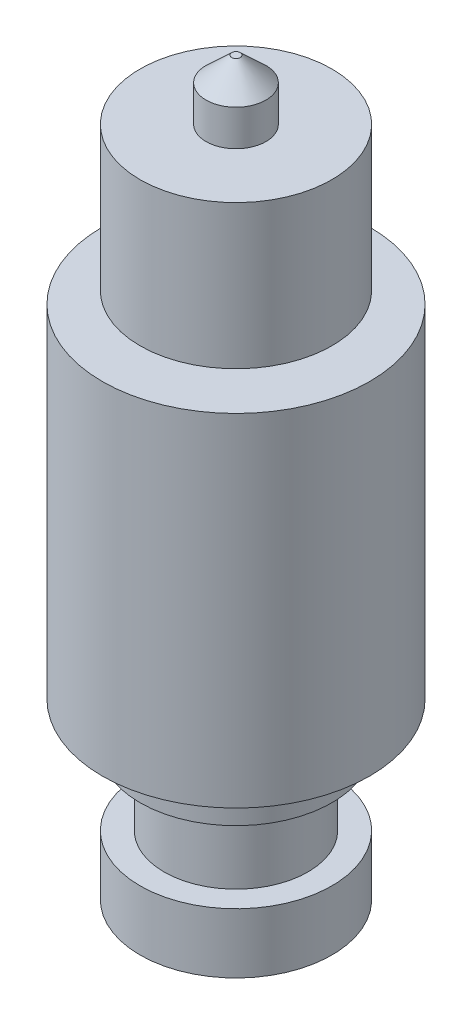
ISO-10303-21;
HEADER;
FILE_DESCRIPTION(('STEP AP214'),'2;1');
FILE_NAME('part.step','',(''),(''),'','','');
FILE_SCHEMA(('AUTOMOTIVE_DESIGN { 1 0 10303 214 1 1 1 1 }'));
ENDSEC;
DATA;
#1=APPLICATION_CONTEXT('core data for automotive mechanical design processes');
#2=APPLICATION_PROTOCOL_DEFINITION('international standard','automotive_design',2000,#1);
#3=PRODUCT_CONTEXT('',#1,'mechanical');
#4=PRODUCT('Part','Part','',(#3));
#5=PRODUCT_RELATED_PRODUCT_CATEGORY('part','',(#4));
#6=PRODUCT_DEFINITION_FORMATION('','',#4);
#7=PRODUCT_DEFINITION_CONTEXT('part definition',#1,'design');
#8=PRODUCT_DEFINITION('design','',#6,#7);
#9=PRODUCT_DEFINITION_SHAPE('','',#8);
#10=(LENGTH_UNIT() NAMED_UNIT(*) SI_UNIT(.MILLI.,.METRE.));
#11=(NAMED_UNIT(*) PLANE_ANGLE_UNIT() SI_UNIT($,.RADIAN.));
#12=(NAMED_UNIT(*) SI_UNIT($,.STERADIAN.) SOLID_ANGLE_UNIT());
#13=UNCERTAINTY_MEASURE_WITH_UNIT(LENGTH_MEASURE(1.E-05),#10,'distance_accuracy_value','');
#14=(GEOMETRIC_REPRESENTATION_CONTEXT(3) GLOBAL_UNCERTAINTY_ASSIGNED_CONTEXT((#13)) GLOBAL_UNIT_ASSIGNED_CONTEXT((#10,
#11,#12)) REPRESENTATION_CONTEXT('',''));
#15=CARTESIAN_POINT('',(0.,0.,0.));
#16=DIRECTION('',(0.,0.,1.));
#17=DIRECTION('',(1.,0.,0.));
#18=AXIS2_PLACEMENT_3D('',#15,#16,#17);
#19=CARTESIAN_POINT('',(0.,5.,0.));
#20=DIRECTION('',(0.,-1.,0.));
#21=DIRECTION('',(0.,0.,-1.));
#22=AXIS2_PLACEMENT_3D('',#19,#20,#21);
#23=CYLINDRICAL_SURFACE('',#22,8.);
#24=CARTESIAN_POINT('',(0.,5.,0.));
#25=DIRECTION('',(0.,1.,0.));
#26=DIRECTION('',(0.,0.,1.));
#27=AXIS2_PLACEMENT_3D('',#24,#25,#26);
#28=CIRCLE('',#27,8.);
#29=CARTESIAN_POINT('',(0.,5.,8.));
#30=VERTEX_POINT('',#29);
#31=EDGE_CURVE('E10',#30,#30,#28,.T.);
#32=ORIENTED_EDGE('',*,*,#31,.F.);
#33=EDGE_LOOP('',(#32));
#34=FACE_BOUND('',#33,.T.);
#35=CARTESIAN_POINT('',(0.,0.,0.));
#36=DIRECTION('',(0.,1.,0.));
#37=DIRECTION('',(0.,0.,1.));
#38=AXIS2_PLACEMENT_3D('',#35,#36,#37);
#39=CIRCLE('',#38,8.);
#40=CARTESIAN_POINT('',(0.,0.,8.));
#41=VERTEX_POINT('',#40);
#42=EDGE_CURVE('E37',#41,#41,#39,.T.);
#43=ORIENTED_EDGE('',*,*,#42,.T.);
#44=EDGE_LOOP('',(#43));
#45=FACE_BOUND('',#44,.T.);
#46=ADVANCED_FACE('F34',(#34,#45),#23,.T.);
#47=CARTESIAN_POINT('',(0.,5.,0.));
#48=DIRECTION('',(0.,1.,0.));
#49=DIRECTION('',(0.,0.,1.));
#50=AXIS2_PLACEMENT_3D('',#47,#48,#49);
#51=PLANE('',#50);
#52=CARTESIAN_POINT('',(0.,5.,0.));
#53=DIRECTION('',(0.,1.,0.));
#54=DIRECTION('',(0.,0.,1.));
#55=AXIS2_PLACEMENT_3D('',#52,#53,#54);
#56=CIRCLE('',#55,6.);
#57=CARTESIAN_POINT('',(0.,5.,6.));
#58=VERTEX_POINT('',#57);
#59=EDGE_CURVE('E46',#58,#58,#56,.T.);
#60=ORIENTED_EDGE('',*,*,#59,.F.);
#61=EDGE_LOOP('',(#60));
#62=FACE_BOUND('',#61,.T.);
#63=ORIENTED_EDGE('',*,*,#31,.T.);
#64=EDGE_LOOP('',(#63));
#65=FACE_BOUND('',#64,.T.);
#66=ADVANCED_FACE('F125',(#62,#65),#51,.T.);
#67=CARTESIAN_POINT('',(0.,0.,0.));
#68=DIRECTION('',(0.,1.,0.));
#69=DIRECTION('',(0.,0.,1.));
#70=AXIS2_PLACEMENT_3D('',#67,#68,#69);
#71=PLANE('',#70);
#72=ORIENTED_EDGE('',*,*,#42,.F.);
#73=EDGE_LOOP('',(#72));
#74=FACE_BOUND('',#73,.T.);
#75=ADVANCED_FACE('F130',(#74),#71,.F.);
#76=CARTESIAN_POINT('',(0.,11.,0.));
#77=DIRECTION('',(0.,-1.,0.));
#78=DIRECTION('',(0.,0.,-1.));
#79=AXIS2_PLACEMENT_3D('',#76,#77,#78);
#80=CYLINDRICAL_SURFACE('',#79,6.);
#81=CARTESIAN_POINT('',(0.,11.,0.));
#82=DIRECTION('',(0.,1.,0.));
#83=DIRECTION('',(0.,0.,1.));
#84=AXIS2_PLACEMENT_3D('',#81,#82,#83);
#85=CIRCLE('',#84,6.);
#86=CARTESIAN_POINT('',(0.,11.,6.));
#87=VERTEX_POINT('',#86);
#88=EDGE_CURVE('E44',#87,#87,#85,.T.);
#89=ORIENTED_EDGE('',*,*,#88,.F.);
#90=EDGE_LOOP('',(#89));
#91=FACE_BOUND('',#90,.T.);
#92=ORIENTED_EDGE('',*,*,#59,.T.);
#93=EDGE_LOOP('',(#92));
#94=FACE_BOUND('',#93,.T.);
#95=ADVANCED_FACE('F137',(#91,#94),#80,.T.);
#96=CARTESIAN_POINT('',(0.,12.5,0.));
#97=DIRECTION('',(0.,-1.,0.));
#98=DIRECTION('',(0.,0.,-1.));
#99=AXIS2_PLACEMENT_3D('',#96,#97,#98);
#100=CYLINDRICAL_SURFACE('',#99,8.);
#101=CARTESIAN_POINT('',(0.,12.5,0.));
#102=DIRECTION('',(0.,1.,0.));
#103=DIRECTION('',(0.,0.,1.));
#104=AXIS2_PLACEMENT_3D('',#101,#102,#103);
#105=CIRCLE('',#104,8.);
#106=CARTESIAN_POINT('',(0.,12.5,8.));
#107=VERTEX_POINT('',#106);
#108=EDGE_CURVE('E49',#107,#107,#105,.T.);
#109=ORIENTED_EDGE('',*,*,#108,.F.);
#110=EDGE_LOOP('',(#109));
#111=FACE_BOUND('',#110,.T.);
#112=CARTESIAN_POINT('',(0.,11.,0.));
#113=DIRECTION('',(0.,1.,0.));
#114=DIRECTION('',(0.,0.,1.));
#115=AXIS2_PLACEMENT_3D('',#112,#113,#114);
#116=CIRCLE('',#115,8.);
#117=CARTESIAN_POINT('',(0.,11.,8.));
#118=VERTEX_POINT('',#117);
#119=EDGE_CURVE('E52',#118,#118,#116,.T.);
#120=ORIENTED_EDGE('',*,*,#119,.T.);
#121=EDGE_LOOP('',(#120));
#122=FACE_BOUND('',#121,.T.);
#123=ADVANCED_FACE('F141',(#111,#122),#100,.T.);
#124=CARTESIAN_POINT('',(0.,12.5,0.));
#125=DIRECTION('',(0.,1.,0.));
#126=DIRECTION('',(0.,0.,1.));
#127=AXIS2_PLACEMENT_3D('',#124,#125,#126);
#128=PLANE('',#127);
#129=CARTESIAN_POINT('',(0.,12.5,0.));
#130=DIRECTION('',(0.,1.,0.));
#131=DIRECTION('',(0.,0.,1.));
#132=AXIS2_PLACEMENT_3D('',#129,#130,#131);
#133=CIRCLE('',#132,5.);
#134=CARTESIAN_POINT('',(0.,12.5,5.));
#135=VERTEX_POINT('',#134);
#136=EDGE_CURVE('E58',#135,#135,#133,.T.);
#137=ORIENTED_EDGE('',*,*,#136,.F.);
#138=EDGE_LOOP('',(#137));
#139=FACE_BOUND('',#138,.T.);
#140=ORIENTED_EDGE('',*,*,#108,.T.);
#141=EDGE_LOOP('',(#140));
#142=FACE_BOUND('',#141,.T.);
#143=ADVANCED_FACE('F147',(#139,#142),#128,.T.);
#144=CARTESIAN_POINT('',(0.,11.,0.));
#145=DIRECTION('',(0.,1.,0.));
#146=DIRECTION('',(0.,0.,1.));
#147=AXIS2_PLACEMENT_3D('',#144,#145,#146);
#148=PLANE('',#147);
#149=ORIENTED_EDGE('',*,*,#88,.T.);
#150=EDGE_LOOP('',(#149));
#151=FACE_BOUND('',#150,.T.);
#152=ORIENTED_EDGE('',*,*,#119,.F.);
#153=EDGE_LOOP('',(#152));
#154=FACE_BOUND('',#153,.T.);
#155=ADVANCED_FACE('F149',(#151,#154),#148,.F.);
#156=CARTESIAN_POINT('',(0.,14.5,0.));
#157=DIRECTION('',(0.,-1.,0.));
#158=DIRECTION('',(0.,0.,-1.));
#159=AXIS2_PLACEMENT_3D('',#156,#157,#158);
#160=CYLINDRICAL_SURFACE('',#159,5.);
#161=CARTESIAN_POINT('',(0.,14.5,0.));
#162=DIRECTION('',(0.,1.,0.));
#163=DIRECTION('',(0.,0.,1.));
#164=AXIS2_PLACEMENT_3D('',#161,#162,#163);
#165=CIRCLE('',#164,5.);
#166=CARTESIAN_POINT('',(0.,14.5,5.));
#167=VERTEX_POINT('',#166);
#168=EDGE_CURVE('E55',#167,#167,#165,.T.);
#169=ORIENTED_EDGE('',*,*,#168,.F.);
#170=EDGE_LOOP('',(#169));
#171=FACE_BOUND('',#170,.T.);
#172=ORIENTED_EDGE('',*,*,#136,.T.);
#173=EDGE_LOOP('',(#172));
#174=FACE_BOUND('',#173,.T.);
#175=ADVANCED_FACE('F152',(#171,#174),#160,.T.);
#176=CARTESIAN_POINT('',(0.,43.,0.));
#177=DIRECTION('',(0.,-1.,0.));
#178=DIRECTION('',(0.,0.,-1.));
#179=AXIS2_PLACEMENT_3D('',#176,#177,#178);
#180=CYLINDRICAL_SURFACE('',#179,11.15);
#181=CARTESIAN_POINT('',(0.,43.,0.));
#182=DIRECTION('',(0.,1.,0.));
#183=DIRECTION('',(0.,0.,1.));
#184=AXIS2_PLACEMENT_3D('',#181,#182,#183);
#185=CIRCLE('',#184,11.15);
#186=CARTESIAN_POINT('',(0.,43.,-11.15));
#187=VERTEX_POINT('',#186);
#188=EDGE_CURVE('E61',#187,#187,#185,.T.);
#189=CARTESIAN_POINT('',(0.,14.5,0.));
#190=DIRECTION('',(0.,1.,0.));
#191=DIRECTION('',(0.,0.,1.));
#192=AXIS2_PLACEMENT_3D('',#189,#190,#191);
#193=CIRCLE('',#192,11.15);
#194=CARTESIAN_POINT('',(0.,14.5,-11.15));
#195=VERTEX_POINT('',#194);
#196=EDGE_CURVE('E64',#195,#195,#193,.T.);
#197=CARTESIAN_POINT('',(0.,43.,-11.15));
#198=CARTESIAN_POINT('',(0.,42.703125,-11.15));
#199=CARTESIAN_POINT('',(0.,42.40625,-11.15));
#200=CARTESIAN_POINT('',(0.,41.8125,-11.15));
#201=CARTESIAN_POINT('',(0.,41.515625,-11.15));
#202=CARTESIAN_POINT('',(0.,40.921875,-11.15));
#203=CARTESIAN_POINT('',(0.,40.625,-11.15));
#204=CARTESIAN_POINT('',(0.,40.03125,-11.15));
#205=CARTESIAN_POINT('',(0.,39.734375,-11.15));
#206=CARTESIAN_POINT('',(0.,39.140625,-11.15));
#207=CARTESIAN_POINT('',(0.,38.84375,-11.15));
#208=CARTESIAN_POINT('',(0.,38.25,-11.15));
#209=CARTESIAN_POINT('',(0.,37.953125,-11.15));
#210=CARTESIAN_POINT('',(0.,37.359375,-11.15));
#211=CARTESIAN_POINT('',(0.,37.0625,-11.15));
#212=CARTESIAN_POINT('',(0.,36.46875,-11.15));
#213=CARTESIAN_POINT('',(0.,36.171875,-11.15));
#214=CARTESIAN_POINT('',(0.,35.578125,-11.15));
#215=CARTESIAN_POINT('',(0.,35.28125,-11.15));
#216=CARTESIAN_POINT('',(0.,34.6875,-11.15));
#217=CARTESIAN_POINT('',(0.,34.390625,-11.15));
#218=CARTESIAN_POINT('',(0.,33.796875,-11.15));
#219=CARTESIAN_POINT('',(0.,33.5,-11.15));
#220=CARTESIAN_POINT('',(0.,32.90625,-11.15));
#221=CARTESIAN_POINT('',(0.,32.609375,-11.15));
#222=CARTESIAN_POINT('',(0.,32.015625,-11.15));
#223=CARTESIAN_POINT('',(0.,31.71875,-11.15));
#224=CARTESIAN_POINT('',(0.,31.125,-11.15));
#225=CARTESIAN_POINT('',(0.,30.828125,-11.15));
#226=CARTESIAN_POINT('',(0.,30.234375,-11.15));
#227=CARTESIAN_POINT('',(0.,29.9375,-11.15));
#228=CARTESIAN_POINT('',(0.,29.34375,-11.15));
#229=CARTESIAN_POINT('',(0.,29.046875,-11.15));
#230=CARTESIAN_POINT('',(0.,28.453125,-11.15));
#231=CARTESIAN_POINT('',(0.,28.15625,-11.15));
#232=CARTESIAN_POINT('',(0.,27.5625,-11.15));
#233=CARTESIAN_POINT('',(0.,27.265625,-11.15));
#234=CARTESIAN_POINT('',(0.,26.671875,-11.15));
#235=CARTESIAN_POINT('',(0.,26.375,-11.15));
#236=CARTESIAN_POINT('',(0.,25.78125,-11.15));
#237=CARTESIAN_POINT('',(0.,25.484375,-11.15));
#238=CARTESIAN_POINT('',(0.,24.890625,-11.15));
#239=CARTESIAN_POINT('',(0.,24.59375,-11.15));
#240=CARTESIAN_POINT('',(0.,24.,-11.15));
#241=CARTESIAN_POINT('',(0.,23.703125,-11.15));
#242=CARTESIAN_POINT('',(0.,23.109375,-11.15));
#243=CARTESIAN_POINT('',(0.,22.8125,-11.15));
#244=CARTESIAN_POINT('',(0.,22.21875,-11.15));
#245=CARTESIAN_POINT('',(0.,21.921875,-11.15));
#246=CARTESIAN_POINT('',(0.,21.328125,-11.15));
#247=CARTESIAN_POINT('',(0.,21.03125,-11.15));
#248=CARTESIAN_POINT('',(0.,20.4375,-11.15));
#249=CARTESIAN_POINT('',(0.,20.140625,-11.15));
#250=CARTESIAN_POINT('',(0.,19.546875,-11.15));
#251=CARTESIAN_POINT('',(0.,19.25,-11.15));
#252=CARTESIAN_POINT('',(0.,18.65625,-11.15));
#253=CARTESIAN_POINT('',(0.,18.359375,-11.15));
#254=CARTESIAN_POINT('',(0.,17.765625,-11.15));
#255=CARTESIAN_POINT('',(0.,17.46875,-11.15));
#256=CARTESIAN_POINT('',(0.,16.875,-11.15));
#257=CARTESIAN_POINT('',(0.,16.578125,-11.15));
#258=CARTESIAN_POINT('',(0.,15.984375,-11.15));
#259=CARTESIAN_POINT('',(0.,15.6875,-11.15));
#260=CARTESIAN_POINT('',(0.,15.09375,-11.15));
#261=CARTESIAN_POINT('',(0.,14.796875,-11.15));
#262=CARTESIAN_POINT('',(0.,14.5,-11.15));
#263=B_SPLINE_CURVE_WITH_KNOTS('',3,(#197,#198,#199,#200,#201,#202,#203,#204,#205,#206,#207,
#208,#209,#210,#211,#212,#213,#214,#215,#216,#217,#218,#219,#220,#221,#222,#223,#224,#225,#226,
#227,#228,#229,#230,#231,#232,#233,#234,#235,#236,#237,#238,#239,#240,#241,#242,#243,#244,#245,
#246,#247,#248,#249,#250,#251,#252,#253,#254,#255,#256,#257,#258,#259,#260,#261,#262),
.UNSPECIFIED.,.F.,.F.,(4,2,2,2,2,2,2,2,2,2,2,2,2,2,2,2,2,2,2,2,2,2,2,2,2,2,2,2,2,2,2,2,4),(0.,
0.890625000000006,1.78125000000001,2.671875,3.5625,4.453125,5.34375,6.234375,7.12500000000001,
8.015625,8.90625,9.796875,10.6875,11.578125,12.46875,13.359375,14.25,15.140625,16.03125,
16.921875,17.8125,18.703125,19.59375,20.484375,21.375,22.265625,23.15625,24.046875,24.9375,
25.828125,26.71875,27.609375,28.5),.UNSPECIFIED.);
#264=EDGE_CURVE('BSEAM159',#187,#195,#263,.T.);
#265=ORIENTED_EDGE('',*,*,#188,.F.);
#266=ORIENTED_EDGE('',*,*,#196,.T.);
#267=ORIENTED_EDGE('',*,*,#264,.T.);
#268=ORIENTED_EDGE('',*,*,#264,.F.);
#269=EDGE_LOOP('',(#265,#267,#266,#268));
#270=FACE_BOUND('',#269,.T.);
#271=ADVANCED_FACE('F159',(#270),#180,.T.);
#272=CARTESIAN_POINT('',(0.,43.,0.));
#273=DIRECTION('',(0.,1.,0.));
#274=DIRECTION('',(0.,0.,1.));
#275=AXIS2_PLACEMENT_3D('',#272,#273,#274);
#276=PLANE('',#275);
#277=CARTESIAN_POINT('',(0.,43.,0.));
#278=DIRECTION('',(0.,1.,0.));
#279=DIRECTION('',(0.,0.,1.));
#280=AXIS2_PLACEMENT_3D('',#277,#278,#279);
#281=CIRCLE('',#280,2.);
#282=CARTESIAN_POINT('',(0.,43.,2.));
#283=VERTEX_POINT('',#282);
#284=EDGE_CURVE('E70',#283,#283,#281,.T.);
#285=ORIENTED_EDGE('',*,*,#284,.F.);
#286=EDGE_LOOP('',(#285));
#287=FACE_BOUND('',#286,.T.);
#288=ORIENTED_EDGE('',*,*,#188,.T.);
#289=EDGE_LOOP('',(#288));
#290=FACE_BOUND('',#289,.T.);
#291=ADVANCED_FACE('F163',(#287,#290),#276,.T.);
#292=CARTESIAN_POINT('',(0.,14.5,0.));
#293=DIRECTION('',(0.,1.,0.));
#294=DIRECTION('',(0.,0.,1.));
#295=AXIS2_PLACEMENT_3D('',#292,#293,#294);
#296=PLANE('',#295);
#297=ORIENTED_EDGE('',*,*,#168,.T.);
#298=EDGE_LOOP('',(#297));
#299=FACE_BOUND('',#298,.T.);
#300=ORIENTED_EDGE('',*,*,#196,.F.);
#301=EDGE_LOOP('',(#300));
#302=FACE_BOUND('',#301,.T.);
#303=ADVANCED_FACE('F165',(#299,#302),#296,.F.);
#304=CARTESIAN_POINT('',(0.,44.,0.));
#305=DIRECTION('',(0.,-1.,0.));
#306=DIRECTION('',(0.,0.,-1.));
#307=AXIS2_PLACEMENT_3D('',#304,#305,#306);
#308=CYLINDRICAL_SURFACE('',#307,2.);
#309=CARTESIAN_POINT('',(0.,44.,0.));
#310=DIRECTION('',(0.,1.,0.));
#311=DIRECTION('',(0.,0.,1.));
#312=AXIS2_PLACEMENT_3D('',#309,#310,#311);
#313=CIRCLE('',#312,2.);
#314=CARTESIAN_POINT('',(0.,44.,2.));
#315=VERTEX_POINT('',#314);
#316=EDGE_CURVE('E67',#315,#315,#313,.T.);
#317=ORIENTED_EDGE('',*,*,#316,.F.);
#318=EDGE_LOOP('',(#317));
#319=FACE_BOUND('',#318,.T.);
#320=ORIENTED_EDGE('',*,*,#284,.T.);
#321=EDGE_LOOP('',(#320));
#322=FACE_BOUND('',#321,.T.);
#323=ADVANCED_FACE('F115',(#319,#322),#308,.T.);
#324=CARTESIAN_POINT('',(0.,56.,0.));
#325=DIRECTION('',(0.,-1.,0.));
#326=DIRECTION('',(0.,0.,-1.));
#327=AXIS2_PLACEMENT_3D('',#324,#325,#326);
#328=CYLINDRICAL_SURFACE('',#327,8.);
#329=CARTESIAN_POINT('',(0.,56.,0.));
#330=DIRECTION('',(0.,1.,0.));
#331=DIRECTION('',(0.,0.,1.));
#332=AXIS2_PLACEMENT_3D('',#329,#330,#331);
#333=CIRCLE('',#332,8.);
#334=CARTESIAN_POINT('',(0.,56.,8.));
#335=VERTEX_POINT('',#334);
#336=EDGE_CURVE('E73',#335,#335,#333,.T.);
#337=ORIENTED_EDGE('',*,*,#336,.F.);
#338=EDGE_LOOP('',(#337));
#339=FACE_BOUND('',#338,.T.);
#340=CARTESIAN_POINT('',(0.,44.,0.));
#341=DIRECTION('',(0.,1.,0.));
#342=DIRECTION('',(0.,0.,1.));
#343=AXIS2_PLACEMENT_3D('',#340,#341,#342);
#344=CIRCLE('',#343,8.);
#345=CARTESIAN_POINT('',(0.,44.,8.));
#346=VERTEX_POINT('',#345);
#347=EDGE_CURVE('E76',#346,#346,#344,.T.);
#348=ORIENTED_EDGE('',*,*,#347,.T.);
#349=EDGE_LOOP('',(#348));
#350=FACE_BOUND('',#349,.T.);
#351=ADVANCED_FACE('F109',(#339,#350),#328,.T.);
#352=CARTESIAN_POINT('',(0.,56.,0.));
#353=DIRECTION('',(0.,1.,0.));
#354=DIRECTION('',(0.,0.,1.));
#355=AXIS2_PLACEMENT_3D('',#352,#353,#354);
#356=PLANE('',#355);
#357=CARTESIAN_POINT('',(0.,56.,0.));
#358=DIRECTION('',(0.,1.,0.));
#359=DIRECTION('',(0.,0.,1.));
#360=AXIS2_PLACEMENT_3D('',#357,#358,#359);
#361=CIRCLE('',#360,2.5);
#362=CARTESIAN_POINT('',(0.,56.,2.5));
#363=VERTEX_POINT('',#362);
#364=EDGE_CURVE('E82',#363,#363,#361,.T.);
#365=ORIENTED_EDGE('',*,*,#364,.F.);
#366=EDGE_LOOP('',(#365));
#367=FACE_BOUND('',#366,.T.);
#368=ORIENTED_EDGE('',*,*,#336,.T.);
#369=EDGE_LOOP('',(#368));
#370=FACE_BOUND('',#369,.T.);
#371=ADVANCED_FACE('F106',(#367,#370),#356,.T.);
#372=CARTESIAN_POINT('',(0.,44.,0.));
#373=DIRECTION('',(0.,1.,0.));
#374=DIRECTION('',(0.,0.,1.));
#375=AXIS2_PLACEMENT_3D('',#372,#373,#374);
#376=PLANE('',#375);
#377=ORIENTED_EDGE('',*,*,#316,.T.);
#378=EDGE_LOOP('',(#377));
#379=FACE_BOUND('',#378,.T.);
#380=ORIENTED_EDGE('',*,*,#347,.F.);
#381=EDGE_LOOP('',(#380));
#382=FACE_BOUND('',#381,.T.);
#383=ADVANCED_FACE('F102',(#379,#382),#376,.F.);
#384=CARTESIAN_POINT('',(0.,59.,0.));
#385=DIRECTION('',(0.,-1.,0.));
#386=DIRECTION('',(0.,0.,-1.));
#387=AXIS2_PLACEMENT_3D('',#384,#385,#386);
#388=CYLINDRICAL_SURFACE('',#387,2.5);
#389=CARTESIAN_POINT('',(0.,59.,0.));
#390=DIRECTION('',(0.,1.,0.));
#391=DIRECTION('',(0.,0.,1.));
#392=AXIS2_PLACEMENT_3D('',#389,#390,#391);
#393=CIRCLE('',#392,2.5);
#394=CARTESIAN_POINT('',(0.,59.,2.5));
#395=VERTEX_POINT('',#394);
#396=EDGE_CURVE('E79',#395,#395,#393,.T.);
#397=ORIENTED_EDGE('',*,*,#396,.F.);
#398=EDGE_LOOP('',(#397));
#399=FACE_BOUND('',#398,.T.);
#400=ORIENTED_EDGE('',*,*,#364,.T.);
#401=EDGE_LOOP('',(#400));
#402=FACE_BOUND('',#401,.T.);
#403=ADVANCED_FACE('F96',(#399,#402),#388,.T.);
#404=CARTESIAN_POINT('',(0.,59.,0.));
#405=DIRECTION('',(0.,-1.,0.));
#406=DIRECTION('',(0.,0.,1.));
#407=AXIS2_PLACEMENT_3D('',#404,#405,#406);
#408=CONICAL_SURFACE('',#407,2.5,0.820304748437336);
#409=CARTESIAN_POINT('',(0.,61.,0.));
#410=DIRECTION('',(0.,1.,0.));
#411=DIRECTION('',(0.,0.,1.));
#412=AXIS2_PLACEMENT_3D('',#409,#410,#411);
#413=CIRCLE('',#412,0.35526257995063);
#414=CARTESIAN_POINT('',(0.,61.,0.355262579950633));
#415=VERTEX_POINT('',#414);
#416=EDGE_CURVE('E85',#415,#415,#413,.T.);
#417=CARTESIAN_POINT('',(0.,61.,0.355262579950633));
#418=CARTESIAN_POINT('',(0.,60.9791666666667,0.377603594742811));
#419=CARTESIAN_POINT('',(0.,60.9583333333333,0.399944609534993));
#420=CARTESIAN_POINT('',(0.,60.9166666666667,0.444626639119357));
#421=CARTESIAN_POINT('',(0.,60.8958333333333,0.46696765391154));
#422=CARTESIAN_POINT('',(0.,60.8541666666667,0.511649683495901));
#423=CARTESIAN_POINT('',(0.,60.8333333333333,0.53399069828808));
#424=CARTESIAN_POINT('',(0.,60.7916666666667,0.578672727872442));
#425=CARTESIAN_POINT('',(0.,60.7708333333333,0.601013742664625));
#426=CARTESIAN_POINT('',(0.,60.7291666666667,0.645695772248987));
#427=CARTESIAN_POINT('',(0.,60.7083333333333,0.668036787041166));
#428=CARTESIAN_POINT('',(0.,60.6666666666667,0.712718816625527));
#429=CARTESIAN_POINT('',(0.,60.6458333333333,0.735059831417711));
#430=CARTESIAN_POINT('',(0.,60.6041666666667,0.779741861002073));
#431=CARTESIAN_POINT('',(0.,60.5833333333333,0.802082875794251));
#432=CARTESIAN_POINT('',(0.,60.5416666666667,0.846764905378613));
#433=CARTESIAN_POINT('',(0.,60.5208333333333,0.869105920170796));
#434=CARTESIAN_POINT('',(0.,60.4791666666667,0.913787949755158));
#435=CARTESIAN_POINT('',(0.,60.4583333333333,0.936128964547337));
#436=CARTESIAN_POINT('',(0.,60.4166666666667,0.980810994131699));
#437=CARTESIAN_POINT('',(0.,60.3958333333333,1.00315200892388));
#438=CARTESIAN_POINT('',(0.,60.3541666666667,1.04783403850824));
#439=CARTESIAN_POINT('',(0.,60.3333333333333,1.07017505330042));
#440=CARTESIAN_POINT('',(0.,60.2916666666667,1.11485708288478));
#441=CARTESIAN_POINT('',(0.,60.2708333333333,1.13719809767697));
#442=CARTESIAN_POINT('',(0.,60.2291666666667,1.18188012726133));
#443=CARTESIAN_POINT('',(0.,60.2083333333333,1.20422114205351));
#444=CARTESIAN_POINT('',(0.,60.1666666666667,1.24890317163787));
#445=CARTESIAN_POINT('',(0.,60.1458333333333,1.27124418643005));
#446=CARTESIAN_POINT('',(0.,60.1041666666667,1.31592621601442));
#447=CARTESIAN_POINT('',(0.,60.0833333333333,1.33826723080659));
#448=CARTESIAN_POINT('',(0.,60.0416666666667,1.38294926039096));
#449=CARTESIAN_POINT('',(0.,60.0208333333333,1.40529027518314));
#450=CARTESIAN_POINT('',(0.,59.9791666666667,1.4499723047675));
#451=CARTESIAN_POINT('',(0.,59.9583333333333,1.47231331955968));
#452=CARTESIAN_POINT('',(0.,59.9166666666667,1.51699534914404));
#453=CARTESIAN_POINT('',(0.,59.8958333333333,1.53933636393622));
#454=CARTESIAN_POINT('',(0.,59.8541666666667,1.58401839352059));
#455=CARTESIAN_POINT('',(0.,59.8333333333333,1.60635940831277));
#456=CARTESIAN_POINT('',(0.,59.7916666666667,1.65104143789713));
#457=CARTESIAN_POINT('',(0.,59.7708333333333,1.67338245268931));
#458=CARTESIAN_POINT('',(0.,59.7291666666667,1.71806448227367));
#459=CARTESIAN_POINT('',(0.,59.7083333333333,1.74040549706585));
#460=CARTESIAN_POINT('',(0.,59.6666666666667,1.78508752665021));
#461=CARTESIAN_POINT('',(0.,59.6458333333333,1.8074285414424));
#462=CARTESIAN_POINT('',(0.,59.6041666666667,1.85211057102676));
#463=CARTESIAN_POINT('',(0.,59.5833333333333,1.87445158581894));
#464=CARTESIAN_POINT('',(0.,59.5416666666667,1.9191336154033));
#465=CARTESIAN_POINT('',(0.,59.5208333333333,1.94147463019548));
#466=CARTESIAN_POINT('',(0.,59.4791666666667,1.98615665977984));
#467=CARTESIAN_POINT('',(0.,59.4583333333333,2.00849767457202));
#468=CARTESIAN_POINT('',(0.,59.4166666666667,2.05317970415638));
#469=CARTESIAN_POINT('',(0.,59.3958333333333,2.07552071894857));
#470=CARTESIAN_POINT('',(0.,59.3541666666667,2.12020274853293));
#471=CARTESIAN_POINT('',(0.,59.3333333333333,2.14254376332511));
#472=CARTESIAN_POINT('',(0.,59.2916666666667,2.18722579290947));
#473=CARTESIAN_POINT('',(0.,59.2708333333333,2.20956680770165));
#474=CARTESIAN_POINT('',(0.,59.2291666666667,2.25424883728601));
#475=CARTESIAN_POINT('',(0.,59.2083333333333,2.27658985207819));
#476=CARTESIAN_POINT('',(0.,59.1666666666667,2.32127188166255));
#477=CARTESIAN_POINT('',(0.,59.1458333333333,2.34361289645474));
#478=CARTESIAN_POINT('',(0.,59.1041666666667,2.3882949260391));
#479=CARTESIAN_POINT('',(0.,59.0833333333333,2.41063594083128));
#480=CARTESIAN_POINT('',(0.,59.0416666666667,2.45531797041564));
#481=CARTESIAN_POINT('',(0.,59.0208333333333,2.47765898520782));
#482=CARTESIAN_POINT('',(0.,59.,2.5));
#483=B_SPLINE_CURVE_WITH_KNOTS('',3,(#417,#418,#419,#420,#421,#422,#423,#424,#425,#426,#427,
#428,#429,#430,#431,#432,#433,#434,#435,#436,#437,#438,#439,#440,#441,#442,#443,#444,#445,#446,
#447,#448,#449,#450,#451,#452,#453,#454,#455,#456,#457,#458,#459,#460,#461,#462,#463,#464,#465,
#466,#467,#468,#469,#470,#471,#472,#473,#474,#475,#476,#477,#478,#479,#480,#481,#482),
.UNSPECIFIED.,.F.,.F.,(4,2,2,2,2,2,2,2,2,2,2,2,2,2,2,2,2,2,2,2,2,2,2,2,2,2,2,2,2,2,2,2,4),(0.,
0.0916424491024816,0.183284898204953,0.274927347307435,0.366569796409907,0.458212245512388,
0.54985469461486,0.641497143717342,0.733139592819814,0.824782041922295,0.916424491024767,
1.00806694012725,1.09970938922972,1.1913518383322,1.28299428743467,1.37463673653716,
1.46627918563963,1.55792163474211,1.64956408384458,1.74120653294706,1.83284898204953,
1.92449143115202,2.01613388025449,2.10777632935697,2.19941877845944,2.29106122756192,
2.38270367666439,2.47434612576688,2.56598857486935,2.65763102397183,2.7492734730743,
2.84091592217678,2.93255837127925),.UNSPECIFIED.);
#484=EDGE_CURVE('BSEAM93',#415,#395,#483,.T.);
#485=ORIENTED_EDGE('',*,*,#416,.F.);
#486=ORIENTED_EDGE('',*,*,#396,.T.);
#487=ORIENTED_EDGE('',*,*,#484,.T.);
#488=ORIENTED_EDGE('',*,*,#484,.F.);
#489=EDGE_LOOP('',(#485,#487,#486,#488));
#490=FACE_BOUND('',#489,.T.);
#491=ADVANCED_FACE('F93',(#490),#408,.T.);
#492=CARTESIAN_POINT('',(0.,61.,0.));
#493=DIRECTION('',(0.,1.,0.));
#494=DIRECTION('',(0.,0.,1.));
#495=AXIS2_PLACEMENT_3D('',#492,#493,#494);
#496=PLANE('',#495);
#497=ORIENTED_EDGE('',*,*,#416,.T.);
#498=EDGE_LOOP('',(#497));
#499=FACE_BOUND('',#498,.T.);
#500=ADVANCED_FACE('F91',(#499),#496,.T.);
#501=CLOSED_SHELL('',(#46,#66,#75,#95,#123,#143,#155,#175,#271,#291,#303,#323,#351,#371,#383,
#403,#491,#500));
#502=MANIFOLD_SOLID_BREP('B2',#501);
#503=ADVANCED_BREP_SHAPE_REPRESENTATION('',(#18,#502),#14);
#504=SHAPE_DEFINITION_REPRESENTATION(#9,#503);
ENDSEC;
END-ISO-10303-21;
